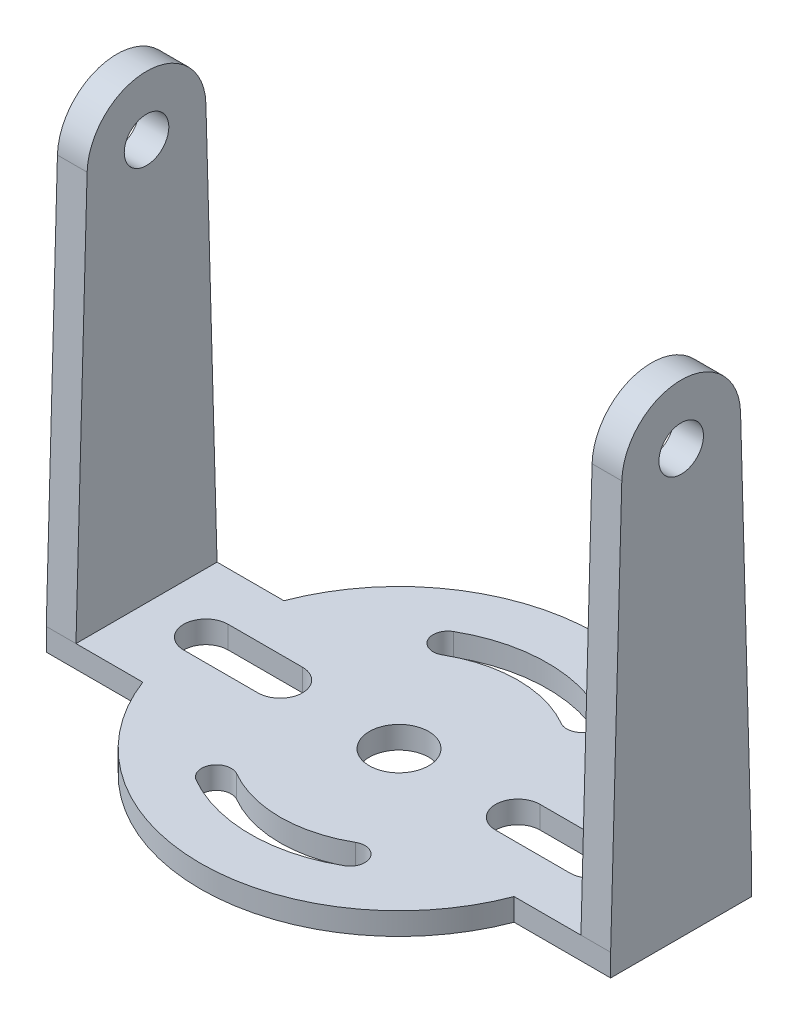
ISO-10303-21;
HEADER;
FILE_DESCRIPTION(('STEP AP214'),'2;1');
FILE_NAME('part.step','',(''),(''),'','','');
FILE_SCHEMA(('AUTOMOTIVE_DESIGN { 1 0 10303 214 1 1 1 1 }'));
ENDSEC;
DATA;
#1=APPLICATION_CONTEXT('core data for automotive mechanical design processes');
#2=APPLICATION_PROTOCOL_DEFINITION('international standard','automotive_design',2000,#1);
#3=PRODUCT_CONTEXT('',#1,'mechanical');
#4=PRODUCT('Part','Part','',(#3));
#5=PRODUCT_RELATED_PRODUCT_CATEGORY('part','',(#4));
#6=PRODUCT_DEFINITION_FORMATION('','',#4);
#7=PRODUCT_DEFINITION_CONTEXT('part definition',#1,'design');
#8=PRODUCT_DEFINITION('design','',#6,#7);
#9=PRODUCT_DEFINITION_SHAPE('','',#8);
#10=(LENGTH_UNIT() NAMED_UNIT(*) SI_UNIT(.MILLI.,.METRE.));
#11=(NAMED_UNIT(*) PLANE_ANGLE_UNIT() SI_UNIT($,.RADIAN.));
#12=(NAMED_UNIT(*) SI_UNIT($,.STERADIAN.) SOLID_ANGLE_UNIT());
#13=UNCERTAINTY_MEASURE_WITH_UNIT(LENGTH_MEASURE(1.E-05),#10,'distance_accuracy_value','');
#14=(GEOMETRIC_REPRESENTATION_CONTEXT(3) GLOBAL_UNCERTAINTY_ASSIGNED_CONTEXT((#13)) GLOBAL_UNIT_ASSIGNED_CONTEXT((#10,
#11,#12)) REPRESENTATION_CONTEXT('',''));
#15=CARTESIAN_POINT('',(0.,0.,0.));
#16=DIRECTION('',(0.,0.,1.));
#17=DIRECTION('',(1.,0.,0.));
#18=AXIS2_PLACEMENT_3D('',#15,#16,#17);
#19=CARTESIAN_POINT('',(38.,0.,0.));
#20=DIRECTION('',(-1.,0.,0.));
#21=DIRECTION('',(0.,0.,1.));
#22=AXIS2_PLACEMENT_3D('',#19,#20,#21);
#23=CYLINDRICAL_SURFACE('',#22,4.);
#24=DIRECTION('',(-1.,0.,0.));
#25=VECTOR('',#24,1.);
#26=CARTESIAN_POINT('',(38.,0.110840887532748,-3.99846399229141));
#27=LINE('',#26,#25);
#28=CARTESIAN_POINT('',(38.,0.110840887532748,-3.99846399229141));
#29=VERTEX_POINT('',#28);
#30=CARTESIAN_POINT('',(36.,0.11084088753275,-3.99846399229141));
#31=VERTEX_POINT('',#30);
#32=EDGE_CURVE('E538',#29,#31,#27,.T.);
#33=ORIENTED_EDGE('',*,*,#32,.T.);
#34=CARTESIAN_POINT('',(36.,0.,0.));
#35=DIRECTION('',(1.,0.,0.));
#36=DIRECTION('',(0.,0.,-1.));
#37=AXIS2_PLACEMENT_3D('',#34,#35,#36);
#38=CIRCLE('',#37,4.);
#39=CARTESIAN_POINT('',(36.,0.110840887532748,3.99846399229141));
#40=VERTEX_POINT('',#39);
#41=EDGE_CURVE('E426',#31,#40,#38,.T.);
#42=ORIENTED_EDGE('',*,*,#41,.T.);
#43=DIRECTION('',(-1.,0.,0.));
#44=VECTOR('',#43,1.);
#45=CARTESIAN_POINT('',(38.,0.110840887532748,3.99846399229141));
#46=LINE('',#45,#44);
#47=CARTESIAN_POINT('',(38.,0.110840887532748,3.99846399229141));
#48=VERTEX_POINT('',#47);
#49=EDGE_CURVE('E551',#48,#40,#46,.T.);
#50=ORIENTED_EDGE('',*,*,#49,.F.);
#51=CARTESIAN_POINT('',(38.,0.,0.));
#52=DIRECTION('',(1.,0.,0.));
#53=DIRECTION('',(0.,0.,-1.));
#54=AXIS2_PLACEMENT_3D('',#51,#52,#53);
#55=CIRCLE('',#54,4.);
#56=EDGE_CURVE('E516',#29,#48,#55,.T.);
#57=ORIENTED_EDGE('',*,*,#56,.F.);
#58=EDGE_LOOP('',(#33,#42,#50,#57));
#59=FACE_BOUND('',#58,.T.);
#60=ADVANCED_FACE('F42',(#59),#23,.T.);
#61=CARTESIAN_POINT('',(38.,0.110840887532748,3.99846399229141));
#62=DIRECTION('',(0.,-0.0277102218831869,-0.999615998072852));
#63=DIRECTION('',(0.,0.999615998072852,-0.0277102218831869));
#64=AXIS2_PLACEMENT_3D('',#61,#62,#63);
#65=PLANE('',#64);
#66=DIRECTION('',(-1.,0.,0.));
#67=VECTOR('',#66,1.);
#68=CARTESIAN_POINT('',(6.5,-27.,4.75));
#69=LINE('',#68,#67);
#70=CARTESIAN_POINT('',(2.,-27.,4.75));
#71=VERTEX_POINT('',#70);
#72=CARTESIAN_POINT('',(0.,-27.,4.75));
#73=VERTEX_POINT('',#72);
#74=EDGE_CURVE('E480',#71,#73,#69,.T.);
#75=ORIENTED_EDGE('',*,*,#74,.F.);
#76=DIRECTION('',(0.,0.999615998072852,-0.0277102218831869));
#77=VECTOR('',#76,1.);
#78=CARTESIAN_POINT('',(2.,0.110840887532748,3.99846399229141));
#79=LINE('',#78,#77);
#80=CARTESIAN_POINT('',(2.,0.110840887532748,3.99846399229141));
#81=VERTEX_POINT('',#80);
#82=EDGE_CURVE('E437',#71,#81,#79,.T.);
#83=ORIENTED_EDGE('',*,*,#82,.T.);
#84=CARTESIAN_POINT('',(0.,0.110840887532748,3.99846399229141));
#85=VERTEX_POINT('',#84);
#86=EDGE_CURVE('E550',#81,#85,#46,.T.);
#87=ORIENTED_EDGE('',*,*,#86,.T.);
#88=DIRECTION('',(0.,-0.999615998072852,0.0277102218831869));
#89=VECTOR('',#88,1.);
#90=CARTESIAN_POINT('',(0.,0.110840887532748,3.99846399229141));
#91=LINE('',#90,#89);
#92=EDGE_CURVE('E531',#85,#73,#91,.T.);
#93=ORIENTED_EDGE('',*,*,#92,.T.);
#94=EDGE_LOOP('',(#75,#83,#87,#93));
#95=FACE_BOUND('',#94,.T.);
#96=ADVANCED_FACE('F643',(#95),#65,.F.);
#97=CARTESIAN_POINT('',(38.,-27.,-4.75));
#98=DIRECTION('',(0.,-0.0277102218831869,0.999615998072852));
#99=DIRECTION('',(0.,-0.999615998072852,-0.0277102218831869));
#100=AXIS2_PLACEMENT_3D('',#97,#98,#99);
#101=PLANE('',#100);
#102=CARTESIAN_POINT('',(2.,0.11084088753275,-3.99846399229141));
#103=VERTEX_POINT('',#102);
#104=CARTESIAN_POINT('',(0.,0.110840887532748,-3.99846399229141));
#105=VERTEX_POINT('',#104);
#106=EDGE_CURVE('E527',#103,#105,#27,.T.);
#107=ORIENTED_EDGE('',*,*,#106,.F.);
#108=DIRECTION('',(0.,-0.999615998072852,-0.0277102218831869));
#109=VECTOR('',#108,1.);
#110=CARTESIAN_POINT('',(2.,-27.,-4.75));
#111=LINE('',#110,#109);
#112=CARTESIAN_POINT('',(2.,-27.,-4.75));
#113=VERTEX_POINT('',#112);
#114=EDGE_CURVE('E11',#103,#113,#111,.T.);
#115=ORIENTED_EDGE('',*,*,#114,.T.);
#116=DIRECTION('',(1.,0.,0.));
#117=VECTOR('',#116,1.);
#118=CARTESIAN_POINT('',(0.,-27.,-4.75));
#119=LINE('',#118,#117);
#120=CARTESIAN_POINT('',(0.,-27.,-4.75));
#121=VERTEX_POINT('',#120);
#122=EDGE_CURVE('E441',#121,#113,#119,.T.);
#123=ORIENTED_EDGE('',*,*,#122,.F.);
#124=DIRECTION('',(0.,0.999615998072852,0.0277102218831869));
#125=VECTOR('',#124,1.);
#126=CARTESIAN_POINT('',(0.,-27.,-4.75));
#127=LINE('',#126,#125);
#128=EDGE_CURVE('E521',#121,#105,#127,.T.);
#129=ORIENTED_EDGE('',*,*,#128,.T.);
#130=EDGE_LOOP('',(#107,#115,#123,#129));
#131=FACE_BOUND('',#130,.T.);
#132=ADVANCED_FACE('F627',(#131),#101,.F.);
#133=CARTESIAN_POINT('',(2.,0.,0.));
#134=DIRECTION('',(-1.,0.,0.));
#135=DIRECTION('',(0.,0.,1.));
#136=AXIS2_PLACEMENT_3D('',#133,#134,#135);
#137=CIRCLE('',#136,4.);
#138=EDGE_CURVE('E434',#81,#103,#137,.T.);
#139=ORIENTED_EDGE('',*,*,#138,.T.);
#140=ORIENTED_EDGE('',*,*,#106,.T.);
#141=CARTESIAN_POINT('',(0.,0.,0.));
#142=DIRECTION('',(1.,0.,0.));
#143=DIRECTION('',(0.,0.,-1.));
#144=AXIS2_PLACEMENT_3D('',#141,#142,#143);
#145=CIRCLE('',#144,4.);
#146=EDGE_CURVE('E515',#105,#85,#145,.T.);
#147=ORIENTED_EDGE('',*,*,#146,.T.);
#148=ORIENTED_EDGE('',*,*,#86,.F.);
#149=EDGE_LOOP('',(#139,#140,#147,#148));
#150=FACE_BOUND('',#149,.T.);
#151=ADVANCED_FACE('F44',(#150),#23,.T.);
#152=ORIENTED_EDGE('',*,*,#49,.T.);
#153=DIRECTION('',(0.,-0.999615998072852,0.0277102218831869));
#154=VECTOR('',#153,1.);
#155=CARTESIAN_POINT('',(36.,0.110840887532748,3.99846399229141));
#156=LINE('',#155,#154);
#157=CARTESIAN_POINT('',(36.,-27.,4.75));
#158=VERTEX_POINT('',#157);
#159=EDGE_CURVE('E430',#40,#158,#156,.T.);
#160=ORIENTED_EDGE('',*,*,#159,.T.);
#161=DIRECTION('',(-1.,0.,0.));
#162=VECTOR('',#161,1.);
#163=CARTESIAN_POINT('',(38.,-27.,4.75));
#164=LINE('',#163,#162);
#165=CARTESIAN_POINT('',(38.,-27.,4.75));
#166=VERTEX_POINT('',#165);
#167=EDGE_CURVE('E546',#166,#158,#164,.T.);
#168=ORIENTED_EDGE('',*,*,#167,.F.);
#169=DIRECTION('',(0.,-0.999615998072852,0.0277102218831869));
#170=VECTOR('',#169,1.);
#171=CARTESIAN_POINT('',(38.,0.110840887532748,3.99846399229141));
#172=LINE('',#171,#170);
#173=EDGE_CURVE('E520',#48,#166,#172,.T.);
#174=ORIENTED_EDGE('',*,*,#173,.F.);
#175=EDGE_LOOP('',(#152,#160,#168,#174));
#176=FACE_BOUND('',#175,.T.);
#177=ADVANCED_FACE('F671',(#176),#65,.F.);
#178=DIRECTION('',(-1.,0.,0.));
#179=VECTOR('',#178,1.);
#180=CARTESIAN_POINT('',(38.,-27.,-4.75));
#181=LINE('',#180,#179);
#182=CARTESIAN_POINT('',(38.,-27.,-4.75));
#183=VERTEX_POINT('',#182);
#184=CARTESIAN_POINT('',(36.,-27.,-4.75));
#185=VERTEX_POINT('',#184);
#186=EDGE_CURVE('E542',#183,#185,#181,.T.);
#187=ORIENTED_EDGE('',*,*,#186,.T.);
#188=DIRECTION('',(0.,0.999615998072852,0.0277102218831869));
#189=VECTOR('',#188,1.);
#190=CARTESIAN_POINT('',(36.,-27.,-4.75));
#191=LINE('',#190,#189);
#192=EDGE_CURVE('E52',#185,#31,#191,.T.);
#193=ORIENTED_EDGE('',*,*,#192,.T.);
#194=ORIENTED_EDGE('',*,*,#32,.F.);
#195=DIRECTION('',(0.,0.999615998072852,0.0277102218831869));
#196=VECTOR('',#195,1.);
#197=CARTESIAN_POINT('',(38.,-27.,-4.75));
#198=LINE('',#197,#196);
#199=EDGE_CURVE('E524',#183,#29,#198,.T.);
#200=ORIENTED_EDGE('',*,*,#199,.F.);
#201=EDGE_LOOP('',(#187,#193,#194,#200));
#202=FACE_BOUND('',#201,.T.);
#203=ADVANCED_FACE('F559',(#202),#101,.F.);
#204=CARTESIAN_POINT('',(38.,0.,0.));
#205=DIRECTION('',(1.,0.,0.));
#206=DIRECTION('',(0.,0.,-1.));
#207=AXIS2_PLACEMENT_3D('',#204,#205,#206);
#208=PLANE('',#207);
#209=CARTESIAN_POINT('',(38.,0.,0.));
#210=DIRECTION('',(1.,0.,0.));
#211=DIRECTION('',(0.,0.,-1.));
#212=AXIS2_PLACEMENT_3D('',#209,#210,#211);
#213=CIRCLE('',#212,1.5);
#214=CARTESIAN_POINT('',(38.,0.,-1.5));
#215=VERTEX_POINT('',#214);
#216=EDGE_CURVE('E1073',#215,#215,#213,.F.);
#217=ORIENTED_EDGE('',*,*,#216,.T.);
#218=EDGE_LOOP('',(#217));
#219=FACE_BOUND('',#218,.T.);
#220=ORIENTED_EDGE('',*,*,#56,.T.);
#221=ORIENTED_EDGE('',*,*,#173,.T.);
#222=DIRECTION('',(0.,1.,0.));
#223=VECTOR('',#222,1.);
#224=CARTESIAN_POINT('',(38.,-28.5,4.75));
#225=LINE('',#224,#223);
#226=CARTESIAN_POINT('',(38.,-28.5,4.75));
#227=VERTEX_POINT('',#226);
#228=EDGE_CURVE('E495',#227,#166,#225,.T.);
#229=ORIENTED_EDGE('',*,*,#228,.F.);
#230=DIRECTION('',(0.,0.,1.));
#231=VECTOR('',#230,1.);
#232=CARTESIAN_POINT('',(38.,-28.5,-4.75));
#233=LINE('',#232,#231);
#234=CARTESIAN_POINT('',(38.,-28.5,-4.75));
#235=VERTEX_POINT('',#234);
#236=EDGE_CURVE('E456',#235,#227,#233,.T.);
#237=ORIENTED_EDGE('',*,*,#236,.F.);
#238=DIRECTION('',(0.,1.,0.));
#239=VECTOR('',#238,1.);
#240=CARTESIAN_POINT('',(38.,-28.5,-4.75));
#241=LINE('',#240,#239);
#242=EDGE_CURVE('E499',#235,#183,#241,.T.);
#243=ORIENTED_EDGE('',*,*,#242,.T.);
#244=ORIENTED_EDGE('',*,*,#199,.T.);
#245=EDGE_LOOP('',(#220,#221,#229,#237,#243,#244));
#246=FACE_BOUND('',#245,.T.);
#247=ADVANCED_FACE('F567',(#219,#246),#208,.T.);
#248=CARTESIAN_POINT('',(0.,0.,0.));
#249=DIRECTION('',(1.,0.,0.));
#250=DIRECTION('',(0.,0.,-1.));
#251=AXIS2_PLACEMENT_3D('',#248,#249,#250);
#252=PLANE('',#251);
#253=CARTESIAN_POINT('',(0.,0.,0.));
#254=DIRECTION('',(-1.,0.,0.));
#255=DIRECTION('',(0.,0.,1.));
#256=AXIS2_PLACEMENT_3D('',#253,#254,#255);
#257=CIRCLE('',#256,1.5);
#258=CARTESIAN_POINT('',(0.,0.,1.5));
#259=VERTEX_POINT('',#258);
#260=EDGE_CURVE('E1068',#259,#259,#257,.T.);
#261=ORIENTED_EDGE('',*,*,#260,.F.);
#262=EDGE_LOOP('',(#261));
#263=FACE_BOUND('',#262,.T.);
#264=ORIENTED_EDGE('',*,*,#146,.F.);
#265=ORIENTED_EDGE('',*,*,#128,.F.);
#266=DIRECTION('',(0.,1.,0.));
#267=VECTOR('',#266,1.);
#268=CARTESIAN_POINT('',(0.,-28.5,-4.75));
#269=LINE('',#268,#267);
#270=CARTESIAN_POINT('',(0.,-28.5,-4.75));
#271=VERTEX_POINT('',#270);
#272=EDGE_CURVE('E511',#271,#121,#269,.T.);
#273=ORIENTED_EDGE('',*,*,#272,.F.);
#274=DIRECTION('',(0.,0.,-1.));
#275=VECTOR('',#274,1.);
#276=CARTESIAN_POINT('',(0.,-28.5,4.75));
#277=LINE('',#276,#275);
#278=CARTESIAN_POINT('',(0.,-28.5,4.75));
#279=VERTEX_POINT('',#278);
#280=EDGE_CURVE('E442',#279,#271,#277,.T.);
#281=ORIENTED_EDGE('',*,*,#280,.F.);
#282=DIRECTION('',(0.,1.,0.));
#283=VECTOR('',#282,1.);
#284=CARTESIAN_POINT('',(0.,-28.5,4.75));
#285=LINE('',#284,#283);
#286=EDGE_CURVE('E468',#279,#73,#285,.T.);
#287=ORIENTED_EDGE('',*,*,#286,.T.);
#288=ORIENTED_EDGE('',*,*,#92,.F.);
#289=EDGE_LOOP('',(#264,#265,#273,#281,#287,#288));
#290=FACE_BOUND('',#289,.T.);
#291=ADVANCED_FACE('F602',(#263,#290),#252,.F.);
#292=CARTESIAN_POINT('',(19.,-27.,0.));
#293=DIRECTION('',(0.,-1.,0.));
#294=DIRECTION('',(0.,0.,-1.));
#295=AXIS2_PLACEMENT_3D('',#292,#293,#294);
#296=PLANE('',#295);
#297=CARTESIAN_POINT('',(19.,-27.,0.));
#298=DIRECTION('',(0.,-1.,0.));
#299=DIRECTION('',(0.,0.,-1.));
#300=AXIS2_PLACEMENT_3D('',#297,#298,#299);
#301=CIRCLE('',#300,7.99999999999999);
#302=CARTESIAN_POINT('',(23.,-27.,6.92820323027552));
#303=VERTEX_POINT('',#302);
#304=CARTESIAN_POINT('',(15.,-27.,6.9282032302755));
#305=VERTEX_POINT('',#304);
#306=EDGE_CURVE('E582',#303,#305,#301,.T.);
#307=ORIENTED_EDGE('',*,*,#306,.F.);
#308=CARTESIAN_POINT('',(23.5,-27.,7.79422863406001));
#309=DIRECTION('',(0.,-1.,0.));
#310=DIRECTION('',(0.,0.,-1.));
#311=AXIS2_PLACEMENT_3D('',#308,#309,#310);
#312=CIRCLE('',#311,1.);
#313=CARTESIAN_POINT('',(24.,-27.,8.6602540378444));
#314=VERTEX_POINT('',#313);
#315=EDGE_CURVE('E283',#314,#303,#312,.F.);
#316=ORIENTED_EDGE('',*,*,#315,.F.);
#317=CARTESIAN_POINT('',(19.,-27.,0.));
#318=DIRECTION('',(0.,-1.,0.));
#319=DIRECTION('',(0.,0.,-1.));
#320=AXIS2_PLACEMENT_3D('',#317,#318,#319);
#321=CIRCLE('',#320,10.);
#322=CARTESIAN_POINT('',(14.,-27.,8.6602540378444));
#323=VERTEX_POINT('',#322);
#324=EDGE_CURVE('E279',#323,#314,#321,.F.);
#325=ORIENTED_EDGE('',*,*,#324,.F.);
#326=CARTESIAN_POINT('',(14.5,-27.,7.79422863405994));
#327=DIRECTION('',(0.,-1.,0.));
#328=DIRECTION('',(0.,0.,-1.));
#329=AXIS2_PLACEMENT_3D('',#326,#327,#328);
#330=CIRCLE('',#329,1.);
#331=EDGE_CURVE('E246',#305,#323,#330,.F.);
#332=ORIENTED_EDGE('',*,*,#331,.F.);
#333=EDGE_LOOP('',(#307,#316,#325,#332));
#334=FACE_BOUND('',#333,.T.);
#335=DIRECTION('',(-1.,0.,0.));
#336=VECTOR('',#335,1.);
#337=CARTESIAN_POINT('',(32.,-27.,-1.5));
#338=LINE('',#337,#336);
#339=CARTESIAN_POINT('',(32.,-27.,-1.5));
#340=VERTEX_POINT('',#339);
#341=CARTESIAN_POINT('',(27.,-27.,-1.5));
#342=VERTEX_POINT('',#341);
#343=EDGE_CURVE('E360',#340,#342,#338,.T.);
#344=ORIENTED_EDGE('',*,*,#343,.F.);
#345=CARTESIAN_POINT('',(32.,-27.,0.));
#346=DIRECTION('',(0.,-1.,0.));
#347=DIRECTION('',(0.,0.,-1.));
#348=AXIS2_PLACEMENT_3D('',#345,#346,#347);
#349=CIRCLE('',#348,1.5);
#350=CARTESIAN_POINT('',(32.,-27.,1.5));
#351=VERTEX_POINT('',#350);
#352=EDGE_CURVE('E330',#351,#340,#349,.F.);
#353=ORIENTED_EDGE('',*,*,#352,.F.);
#354=DIRECTION('',(1.,0.,0.));
#355=VECTOR('',#354,1.);
#356=CARTESIAN_POINT('',(32.,-27.,1.5));
#357=LINE('',#356,#355);
#358=CARTESIAN_POINT('',(27.,-27.,1.5));
#359=VERTEX_POINT('',#358);
#360=EDGE_CURVE('E327',#359,#351,#357,.T.);
#361=ORIENTED_EDGE('',*,*,#360,.F.);
#362=CARTESIAN_POINT('',(27.,-27.,0.));
#363=DIRECTION('',(0.,-1.,0.));
#364=DIRECTION('',(0.,0.,-1.));
#365=AXIS2_PLACEMENT_3D('',#362,#363,#364);
#366=CIRCLE('',#365,1.5);
#367=EDGE_CURVE('E345',#342,#359,#366,.F.);
#368=ORIENTED_EDGE('',*,*,#367,.F.);
#369=EDGE_LOOP('',(#344,#353,#361,#368));
#370=FACE_BOUND('',#369,.T.);
#371=DIRECTION('',(1.,0.,0.));
#372=VECTOR('',#371,1.);
#373=CARTESIAN_POINT('',(6.,-27.,1.5));
#374=LINE('',#373,#372);
#375=CARTESIAN_POINT('',(6.,-27.,1.5));
#376=VERTEX_POINT('',#375);
#377=CARTESIAN_POINT('',(11.,-27.,1.5));
#378=VERTEX_POINT('',#377);
#379=EDGE_CURVE('E321',#376,#378,#374,.T.);
#380=ORIENTED_EDGE('',*,*,#379,.F.);
#381=CARTESIAN_POINT('',(6.,-27.,0.));
#382=DIRECTION('',(0.,-1.,0.));
#383=DIRECTION('',(0.,0.,-1.));
#384=AXIS2_PLACEMENT_3D('',#381,#382,#383);
#385=CIRCLE('',#384,1.5);
#386=CARTESIAN_POINT('',(6.,-27.,-1.5));
#387=VERTEX_POINT('',#386);
#388=EDGE_CURVE('E287',#387,#376,#385,.F.);
#389=ORIENTED_EDGE('',*,*,#388,.F.);
#390=DIRECTION('',(-1.,0.,0.));
#391=VECTOR('',#390,1.);
#392=CARTESIAN_POINT('',(6.,-27.,-1.5));
#393=LINE('',#392,#391);
#394=CARTESIAN_POINT('',(11.,-27.,-1.5));
#395=VERTEX_POINT('',#394);
#396=EDGE_CURVE('E284',#395,#387,#393,.T.);
#397=ORIENTED_EDGE('',*,*,#396,.F.);
#398=CARTESIAN_POINT('',(11.,-27.,0.));
#399=DIRECTION('',(0.,-1.,0.));
#400=DIRECTION('',(0.,0.,-1.));
#401=AXIS2_PLACEMENT_3D('',#398,#399,#400);
#402=CIRCLE('',#401,1.5);
#403=EDGE_CURVE('E303',#378,#395,#402,.F.);
#404=ORIENTED_EDGE('',*,*,#403,.F.);
#405=EDGE_LOOP('',(#380,#389,#397,#404));
#406=FACE_BOUND('',#405,.T.);
#407=CARTESIAN_POINT('',(19.,-27.,0.));
#408=DIRECTION('',(0.,-1.,0.));
#409=DIRECTION('',(0.,0.,-1.));
#410=AXIS2_PLACEMENT_3D('',#407,#408,#409);
#411=CIRCLE('',#410,2.);
#412=CARTESIAN_POINT('',(19.,-27.,-2.));
#413=VERTEX_POINT('',#412);
#414=EDGE_CURVE('E318',#413,#413,#411,.F.);
#415=ORIENTED_EDGE('',*,*,#414,.F.);
#416=EDGE_LOOP('',(#415));
#417=FACE_BOUND('',#416,.T.);
#418=CARTESIAN_POINT('',(14.5,-27.,-7.79422863405994));
#419=DIRECTION('',(0.,-1.,0.));
#420=DIRECTION('',(0.,0.,-1.));
#421=AXIS2_PLACEMENT_3D('',#418,#419,#420);
#422=CIRCLE('',#421,1.);
#423=CARTESIAN_POINT('',(14.,-27.,-8.66025403784439));
#424=VERTEX_POINT('',#423);
#425=CARTESIAN_POINT('',(15.,-27.,-6.92820323027552));
#426=VERTEX_POINT('',#425);
#427=EDGE_CURVE('E401',#424,#426,#422,.F.);
#428=ORIENTED_EDGE('',*,*,#427,.F.);
#429=CARTESIAN_POINT('',(19.,-27.,0.));
#430=DIRECTION('',(0.,-1.,0.));
#431=DIRECTION('',(0.,0.,-1.));
#432=AXIS2_PLACEMENT_3D('',#429,#430,#431);
#433=CIRCLE('',#432,10.);
#434=CARTESIAN_POINT('',(24.,-27.,-8.66025403784444));
#435=VERTEX_POINT('',#434);
#436=EDGE_CURVE('E368',#435,#424,#433,.F.);
#437=ORIENTED_EDGE('',*,*,#436,.F.);
#438=CARTESIAN_POINT('',(23.5,-27.,-7.79422863406001));
#439=DIRECTION('',(0.,-1.,0.));
#440=DIRECTION('',(0.,0.,-1.));
#441=AXIS2_PLACEMENT_3D('',#438,#439,#440);
#442=CIRCLE('',#441,1.);
#443=CARTESIAN_POINT('',(23.,-27.,-6.92820323027555));
#444=VERTEX_POINT('',#443);
#445=EDGE_CURVE('E365',#444,#435,#442,.F.);
#446=ORIENTED_EDGE('',*,*,#445,.F.);
#447=CARTESIAN_POINT('',(19.,-27.,0.));
#448=DIRECTION('',(0.,-1.,0.));
#449=DIRECTION('',(0.,0.,-1.));
#450=AXIS2_PLACEMENT_3D('',#447,#448,#449);
#451=CIRCLE('',#450,7.99999999999999);
#452=EDGE_CURVE('E384',#426,#444,#451,.T.);
#453=ORIENTED_EDGE('',*,*,#452,.F.);
#454=EDGE_LOOP('',(#428,#437,#446,#453));
#455=FACE_BOUND('',#454,.T.);
#456=CARTESIAN_POINT('',(19.,-27.,0.));
#457=DIRECTION('',(0.,-1.,0.));
#458=DIRECTION('',(0.,0.,-1.));
#459=AXIS2_PLACEMENT_3D('',#456,#457,#458);
#460=CIRCLE('',#459,13.3720791203163);
#461=CARTESIAN_POINT('',(6.5,-27.,-4.75));
#462=VERTEX_POINT('',#461);
#463=CARTESIAN_POINT('',(31.5,-27.,-4.75));
#464=VERTEX_POINT('',#463);
#465=EDGE_CURVE('E472',#462,#464,#460,.T.);
#466=ORIENTED_EDGE('',*,*,#465,.F.);
#467=DIRECTION('',(1.,0.,0.));
#468=VECTOR('',#467,1.);
#469=CARTESIAN_POINT('',(2.,-27.,-4.75));
#470=LINE('',#469,#468);
#471=EDGE_CURVE('E417',#113,#462,#470,.T.);
#472=ORIENTED_EDGE('',*,*,#471,.F.);
#473=DIRECTION('',(0.,0.,-1.));
#474=VECTOR('',#473,1.);
#475=CARTESIAN_POINT('',(2.,-27.,4.75));
#476=LINE('',#475,#474);
#477=EDGE_CURVE('E282',#71,#113,#476,.T.);
#478=ORIENTED_EDGE('',*,*,#477,.F.);
#479=CARTESIAN_POINT('',(6.5,-27.,4.75));
#480=VERTEX_POINT('',#479);
#481=EDGE_CURVE('E447',#480,#71,#69,.T.);
#482=ORIENTED_EDGE('',*,*,#481,.F.);
#483=CARTESIAN_POINT('',(19.,-27.,0.));
#484=DIRECTION('',(0.,-1.,0.));
#485=DIRECTION('',(0.,0.,-1.));
#486=AXIS2_PLACEMENT_3D('',#483,#484,#485);
#487=CIRCLE('',#486,13.3720791203163);
#488=CARTESIAN_POINT('',(31.5,-27.,4.75));
#489=VERTEX_POINT('',#488);
#490=EDGE_CURVE('E476',#489,#480,#487,.T.);
#491=ORIENTED_EDGE('',*,*,#490,.F.);
#492=DIRECTION('',(-1.,0.,0.));
#493=VECTOR('',#492,1.);
#494=CARTESIAN_POINT('',(2.,-27.,4.75));
#495=LINE('',#494,#493);
#496=EDGE_CURVE('E423',#158,#489,#495,.T.);
#497=ORIENTED_EDGE('',*,*,#496,.F.);
#498=DIRECTION('',(0.,0.,1.));
#499=VECTOR('',#498,1.);
#500=CARTESIAN_POINT('',(36.,-27.,4.75));
#501=LINE('',#500,#499);
#502=EDGE_CURVE('E420',#185,#158,#501,.T.);
#503=ORIENTED_EDGE('',*,*,#502,.F.);
#504=EDGE_CURVE('E416',#464,#185,#470,.T.);
#505=ORIENTED_EDGE('',*,*,#504,.F.);
#506=EDGE_LOOP('',(#466,#472,#478,#482,#491,#497,#503,#505));
#507=FACE_BOUND('',#506,.T.);
#508=ADVANCED_FACE('F598',(#334,#370,#406,#417,#455,#507),#296,.F.);
#509=CARTESIAN_POINT('',(0.,-28.5,-4.75));
#510=DIRECTION('',(0.,0.,1.));
#511=DIRECTION('',(1.,0.,0.));
#512=AXIS2_PLACEMENT_3D('',#509,#510,#511);
#513=PLANE('',#512);
#514=ORIENTED_EDGE('',*,*,#122,.T.);
#515=ORIENTED_EDGE('',*,*,#471,.T.);
#516=DIRECTION('',(0.,1.,0.));
#517=VECTOR('',#516,1.);
#518=CARTESIAN_POINT('',(6.5,-28.5,-4.74999999999999));
#519=LINE('',#518,#517);
#520=CARTESIAN_POINT('',(6.5,-28.5,-4.74999999999999));
#521=VERTEX_POINT('',#520);
#522=EDGE_CURVE('E507',#521,#462,#519,.T.);
#523=ORIENTED_EDGE('',*,*,#522,.F.);
#524=DIRECTION('',(1.,0.,0.));
#525=VECTOR('',#524,1.);
#526=CARTESIAN_POINT('',(0.,-28.5,-4.75));
#527=LINE('',#526,#525);
#528=EDGE_CURVE('E446',#271,#521,#527,.T.);
#529=ORIENTED_EDGE('',*,*,#528,.F.);
#530=ORIENTED_EDGE('',*,*,#272,.T.);
#531=EDGE_LOOP('',(#514,#515,#523,#529,#530));
#532=FACE_BOUND('',#531,.T.);
#533=ADVANCED_FACE('F601',(#532),#513,.F.);
#534=CARTESIAN_POINT('',(19.,-28.5,0.));
#535=DIRECTION('',(0.,1.,0.));
#536=DIRECTION('',(0.,0.,1.));
#537=AXIS2_PLACEMENT_3D('',#534,#535,#536);
#538=CYLINDRICAL_SURFACE('',#537,13.3720791203163);
#539=ORIENTED_EDGE('',*,*,#465,.T.);
#540=DIRECTION('',(0.,1.,0.));
#541=VECTOR('',#540,1.);
#542=CARTESIAN_POINT('',(31.5,-28.5,-4.75));
#543=LINE('',#542,#541);
#544=CARTESIAN_POINT('',(31.5,-28.5,-4.75));
#545=VERTEX_POINT('',#544);
#546=EDGE_CURVE('E503',#545,#464,#543,.T.);
#547=ORIENTED_EDGE('',*,*,#546,.F.);
#548=CARTESIAN_POINT('',(19.,-28.5,0.));
#549=DIRECTION('',(0.,-1.,0.));
#550=DIRECTION('',(0.,0.,-1.));
#551=AXIS2_PLACEMENT_3D('',#548,#549,#550);
#552=CIRCLE('',#551,13.3720791203163);
#553=EDGE_CURVE('E450',#521,#545,#552,.T.);
#554=ORIENTED_EDGE('',*,*,#553,.F.);
#555=ORIENTED_EDGE('',*,*,#522,.T.);
#556=EDGE_LOOP('',(#539,#547,#554,#555));
#557=FACE_BOUND('',#556,.T.);
#558=ADVANCED_FACE('F619',(#557),#538,.T.);
#559=CARTESIAN_POINT('',(31.5,-28.5,-4.75));
#560=DIRECTION('',(0.,0.,1.));
#561=DIRECTION('',(1.,0.,0.));
#562=AXIS2_PLACEMENT_3D('',#559,#560,#561);
#563=PLANE('',#562);
#564=ORIENTED_EDGE('',*,*,#186,.F.);
#565=ORIENTED_EDGE('',*,*,#242,.F.);
#566=DIRECTION('',(1.,0.,0.));
#567=VECTOR('',#566,1.);
#568=CARTESIAN_POINT('',(31.5,-28.5,-4.75));
#569=LINE('',#568,#567);
#570=EDGE_CURVE('E453',#545,#235,#569,.T.);
#571=ORIENTED_EDGE('',*,*,#570,.F.);
#572=ORIENTED_EDGE('',*,*,#546,.T.);
#573=ORIENTED_EDGE('',*,*,#504,.T.);
#574=EDGE_LOOP('',(#564,#565,#571,#572,#573));
#575=FACE_BOUND('',#574,.T.);
#576=ADVANCED_FACE('F574',(#575),#563,.F.);
#577=CARTESIAN_POINT('',(38.,-28.5,4.75));
#578=DIRECTION('',(0.,0.,-1.));
#579=DIRECTION('',(-1.,0.,0.));
#580=AXIS2_PLACEMENT_3D('',#577,#578,#579);
#581=PLANE('',#580);
#582=ORIENTED_EDGE('',*,*,#167,.T.);
#583=ORIENTED_EDGE('',*,*,#496,.T.);
#584=DIRECTION('',(0.,1.,0.));
#585=VECTOR('',#584,1.);
#586=CARTESIAN_POINT('',(31.5,-28.5,4.75));
#587=LINE('',#586,#585);
#588=CARTESIAN_POINT('',(31.5,-28.5,4.75));
#589=VERTEX_POINT('',#588);
#590=EDGE_CURVE('E491',#589,#489,#587,.T.);
#591=ORIENTED_EDGE('',*,*,#590,.F.);
#592=DIRECTION('',(-1.,0.,0.));
#593=VECTOR('',#592,1.);
#594=CARTESIAN_POINT('',(38.,-28.5,4.75));
#595=LINE('',#594,#593);
#596=EDGE_CURVE('E459',#227,#589,#595,.T.);
#597=ORIENTED_EDGE('',*,*,#596,.F.);
#598=ORIENTED_EDGE('',*,*,#228,.T.);
#599=EDGE_LOOP('',(#582,#583,#591,#597,#598));
#600=FACE_BOUND('',#599,.T.);
#601=ADVANCED_FACE('F700',(#600),#581,.F.);
#602=CARTESIAN_POINT('',(19.,-28.5,0.));
#603=DIRECTION('',(0.,1.,0.));
#604=DIRECTION('',(0.,0.,1.));
#605=AXIS2_PLACEMENT_3D('',#602,#603,#604);
#606=CYLINDRICAL_SURFACE('',#605,13.3720791203163);
#607=ORIENTED_EDGE('',*,*,#490,.T.);
#608=DIRECTION('',(0.,1.,0.));
#609=VECTOR('',#608,1.);
#610=CARTESIAN_POINT('',(6.5,-28.5,4.75));
#611=LINE('',#610,#609);
#612=CARTESIAN_POINT('',(6.5,-28.5,4.75));
#613=VERTEX_POINT('',#612);
#614=EDGE_CURVE('E487',#613,#480,#611,.T.);
#615=ORIENTED_EDGE('',*,*,#614,.F.);
#616=CARTESIAN_POINT('',(19.,-28.5,0.));
#617=DIRECTION('',(0.,-1.,0.));
#618=DIRECTION('',(0.,0.,-1.));
#619=AXIS2_PLACEMENT_3D('',#616,#617,#618);
#620=CIRCLE('',#619,13.3720791203163);
#621=EDGE_CURVE('E462',#589,#613,#620,.T.);
#622=ORIENTED_EDGE('',*,*,#621,.F.);
#623=ORIENTED_EDGE('',*,*,#590,.T.);
#624=EDGE_LOOP('',(#607,#615,#622,#623));
#625=FACE_BOUND('',#624,.T.);
#626=ADVANCED_FACE('F648',(#625),#606,.T.);
#627=CARTESIAN_POINT('',(6.5,-28.5,4.75));
#628=DIRECTION('',(0.,0.,-1.));
#629=DIRECTION('',(-1.,0.,0.));
#630=AXIS2_PLACEMENT_3D('',#627,#628,#629);
#631=PLANE('',#630);
#632=ORIENTED_EDGE('',*,*,#481,.T.);
#633=ORIENTED_EDGE('',*,*,#74,.T.);
#634=ORIENTED_EDGE('',*,*,#286,.F.);
#635=DIRECTION('',(-1.,0.,0.));
#636=VECTOR('',#635,1.);
#637=CARTESIAN_POINT('',(6.5,-28.5,4.75));
#638=LINE('',#637,#636);
#639=EDGE_CURVE('E465',#613,#279,#638,.T.);
#640=ORIENTED_EDGE('',*,*,#639,.F.);
#641=ORIENTED_EDGE('',*,*,#614,.T.);
#642=EDGE_LOOP('',(#632,#633,#634,#640,#641));
#643=FACE_BOUND('',#642,.T.);
#644=ADVANCED_FACE('F640',(#643),#631,.F.);
#645=CARTESIAN_POINT('',(19.,-28.5,0.));
#646=DIRECTION('',(0.,-1.,0.));
#647=DIRECTION('',(0.,0.,-1.));
#648=AXIS2_PLACEMENT_3D('',#645,#646,#647);
#649=PLANE('',#648);
#650=CARTESIAN_POINT('',(23.5,-28.5,7.79422863406001));
#651=DIRECTION('',(0.,-1.,0.));
#652=DIRECTION('',(0.,0.,1.));
#653=AXIS2_PLACEMENT_3D('',#650,#651,#652);
#654=CIRCLE('',#653,1.);
#655=CARTESIAN_POINT('',(23.,-28.5,6.92820323027552));
#656=VERTEX_POINT('',#655);
#657=CARTESIAN_POINT('',(24.,-28.5,8.6602540378444));
#658=VERTEX_POINT('',#657);
#659=EDGE_CURVE('E260',#656,#658,#654,.T.);
#660=ORIENTED_EDGE('',*,*,#659,.F.);
#661=CARTESIAN_POINT('',(19.,-28.5,0.));
#662=DIRECTION('',(0.,1.,0.));
#663=DIRECTION('',(0.,0.,-1.));
#664=AXIS2_PLACEMENT_3D('',#661,#662,#663);
#665=CIRCLE('',#664,7.99999999999999);
#666=CARTESIAN_POINT('',(15.,-28.5,6.9282032302755));
#667=VERTEX_POINT('',#666);
#668=EDGE_CURVE('E265',#667,#656,#665,.T.);
#669=ORIENTED_EDGE('',*,*,#668,.F.);
#670=CARTESIAN_POINT('',(14.5,-28.5,7.79422863405994));
#671=DIRECTION('',(0.,-1.,0.));
#672=DIRECTION('',(0.,0.,-1.));
#673=AXIS2_PLACEMENT_3D('',#670,#671,#672);
#674=CIRCLE('',#673,1.);
#675=CARTESIAN_POINT('',(14.,-28.5,8.6602540378444));
#676=VERTEX_POINT('',#675);
#677=EDGE_CURVE('E243',#676,#667,#674,.T.);
#678=ORIENTED_EDGE('',*,*,#677,.F.);
#679=CARTESIAN_POINT('',(19.,-28.5,0.));
#680=DIRECTION('',(0.,-1.,0.));
#681=DIRECTION('',(0.,0.,-1.));
#682=AXIS2_PLACEMENT_3D('',#679,#680,#681);
#683=CIRCLE('',#682,10.);
#684=EDGE_CURVE('E254',#658,#676,#683,.T.);
#685=ORIENTED_EDGE('',*,*,#684,.F.);
#686=EDGE_LOOP('',(#660,#669,#678,#685));
#687=FACE_BOUND('',#686,.T.);
#688=CARTESIAN_POINT('',(32.,-28.5,0.));
#689=DIRECTION('',(0.,-1.,0.));
#690=DIRECTION('',(0.,0.,1.));
#691=AXIS2_PLACEMENT_3D('',#688,#689,#690);
#692=CIRCLE('',#691,1.5);
#693=CARTESIAN_POINT('',(32.,-28.5,-1.5));
#694=VERTEX_POINT('',#693);
#695=CARTESIAN_POINT('',(32.,-28.5,1.5));
#696=VERTEX_POINT('',#695);
#697=EDGE_CURVE('E288',#694,#696,#692,.T.);
#698=ORIENTED_EDGE('',*,*,#697,.F.);
#699=DIRECTION('',(1.,0.,0.));
#700=VECTOR('',#699,1.);
#701=CARTESIAN_POINT('',(32.,-28.5,-1.5));
#702=LINE('',#701,#700);
#703=CARTESIAN_POINT('',(27.,-28.5,-1.5));
#704=VERTEX_POINT('',#703);
#705=EDGE_CURVE('E336',#704,#694,#702,.T.);
#706=ORIENTED_EDGE('',*,*,#705,.F.);
#707=CARTESIAN_POINT('',(27.,-28.5,0.));
#708=DIRECTION('',(0.,-1.,0.));
#709=DIRECTION('',(0.,0.,-1.));
#710=AXIS2_PLACEMENT_3D('',#707,#708,#709);
#711=CIRCLE('',#710,1.5);
#712=CARTESIAN_POINT('',(27.,-28.5,1.5));
#713=VERTEX_POINT('',#712);
#714=EDGE_CURVE('E349',#713,#704,#711,.T.);
#715=ORIENTED_EDGE('',*,*,#714,.F.);
#716=DIRECTION('',(-1.,0.,0.));
#717=VECTOR('',#716,1.);
#718=CARTESIAN_POINT('',(32.,-28.5,1.5));
#719=LINE('',#718,#717);
#720=EDGE_CURVE('E353',#696,#713,#719,.T.);
#721=ORIENTED_EDGE('',*,*,#720,.F.);
#722=EDGE_LOOP('',(#698,#706,#715,#721));
#723=FACE_BOUND('',#722,.T.);
#724=CARTESIAN_POINT('',(6.,-28.5,0.));
#725=DIRECTION('',(0.,-1.,0.));
#726=DIRECTION('',(0.,0.,-1.));
#727=AXIS2_PLACEMENT_3D('',#724,#725,#726);
#728=CIRCLE('',#727,1.5);
#729=CARTESIAN_POINT('',(6.,-28.5,1.5));
#730=VERTEX_POINT('',#729);
#731=CARTESIAN_POINT('',(6.,-28.5,-1.5));
#732=VERTEX_POINT('',#731);
#733=EDGE_CURVE('E315',#730,#732,#728,.T.);
#734=ORIENTED_EDGE('',*,*,#733,.F.);
#735=DIRECTION('',(-1.,0.,0.));
#736=VECTOR('',#735,1.);
#737=CARTESIAN_POINT('',(6.,-28.5,1.5));
#738=LINE('',#737,#736);
#739=CARTESIAN_POINT('',(11.,-28.5,1.5));
#740=VERTEX_POINT('',#739);
#741=EDGE_CURVE('E293',#740,#730,#738,.T.);
#742=ORIENTED_EDGE('',*,*,#741,.F.);
#743=CARTESIAN_POINT('',(11.,-28.5,0.));
#744=DIRECTION('',(0.,-1.,0.));
#745=DIRECTION('',(0.,0.,1.));
#746=AXIS2_PLACEMENT_3D('',#743,#744,#745);
#747=CIRCLE('',#746,1.5);
#748=CARTESIAN_POINT('',(11.,-28.5,-1.5));
#749=VERTEX_POINT('',#748);
#750=EDGE_CURVE('E307',#749,#740,#747,.T.);
#751=ORIENTED_EDGE('',*,*,#750,.F.);
#752=DIRECTION('',(1.,0.,0.));
#753=VECTOR('',#752,1.);
#754=CARTESIAN_POINT('',(6.,-28.5,-1.5));
#755=LINE('',#754,#753);
#756=EDGE_CURVE('E311',#732,#749,#755,.T.);
#757=ORIENTED_EDGE('',*,*,#756,.F.);
#758=EDGE_LOOP('',(#734,#742,#751,#757));
#759=FACE_BOUND('',#758,.T.);
#760=CARTESIAN_POINT('',(19.,-28.5,0.));
#761=DIRECTION('',(0.,-1.,0.));
#762=DIRECTION('',(0.,0.,-1.));
#763=AXIS2_PLACEMENT_3D('',#760,#761,#762);
#764=CIRCLE('',#763,2.);
#765=CARTESIAN_POINT('',(19.,-28.5,-2.));
#766=VERTEX_POINT('',#765);
#767=EDGE_CURVE('E369',#766,#766,#764,.T.);
#768=ORIENTED_EDGE('',*,*,#767,.F.);
#769=EDGE_LOOP('',(#768));
#770=FACE_BOUND('',#769,.T.);
#771=CARTESIAN_POINT('',(19.,-28.5,0.));
#772=DIRECTION('',(0.,-1.,0.));
#773=DIRECTION('',(0.,0.,1.));
#774=AXIS2_PLACEMENT_3D('',#771,#772,#773);
#775=CIRCLE('',#774,10.);
#776=CARTESIAN_POINT('',(14.,-28.5,-8.66025403784439));
#777=VERTEX_POINT('',#776);
#778=CARTESIAN_POINT('',(24.,-28.5,-8.66025403784444));
#779=VERTEX_POINT('',#778);
#780=EDGE_CURVE('E396',#777,#779,#775,.T.);
#781=ORIENTED_EDGE('',*,*,#780,.F.);
#782=CARTESIAN_POINT('',(14.5,-28.5,-7.79422863405994));
#783=DIRECTION('',(0.,-1.,0.));
#784=DIRECTION('',(0.,0.,1.));
#785=AXIS2_PLACEMENT_3D('',#782,#783,#784);
#786=CIRCLE('',#785,1.);
#787=CARTESIAN_POINT('',(15.,-28.5,-6.92820323027551));
#788=VERTEX_POINT('',#787);
#789=EDGE_CURVE('E374',#788,#777,#786,.T.);
#790=ORIENTED_EDGE('',*,*,#789,.F.);
#791=CARTESIAN_POINT('',(19.,-28.5,0.));
#792=DIRECTION('',(0.,1.,0.));
#793=DIRECTION('',(0.,0.,1.));
#794=AXIS2_PLACEMENT_3D('',#791,#792,#793);
#795=CIRCLE('',#794,7.99999999999999);
#796=CARTESIAN_POINT('',(23.,-28.5,-6.92820323027555));
#797=VERTEX_POINT('',#796);
#798=EDGE_CURVE('E388',#797,#788,#795,.T.);
#799=ORIENTED_EDGE('',*,*,#798,.F.);
#800=CARTESIAN_POINT('',(23.5,-28.5,-7.79422863406001));
#801=DIRECTION('',(0.,-1.,0.));
#802=DIRECTION('',(0.,0.,-1.));
#803=AXIS2_PLACEMENT_3D('',#800,#801,#802);
#804=CIRCLE('',#803,1.);
#805=EDGE_CURVE('E392',#779,#797,#804,.T.);
#806=ORIENTED_EDGE('',*,*,#805,.F.);
#807=EDGE_LOOP('',(#781,#790,#799,#806));
#808=FACE_BOUND('',#807,.T.);
#809=ORIENTED_EDGE('',*,*,#280,.T.);
#810=ORIENTED_EDGE('',*,*,#528,.T.);
#811=ORIENTED_EDGE('',*,*,#553,.T.);
#812=ORIENTED_EDGE('',*,*,#570,.T.);
#813=ORIENTED_EDGE('',*,*,#236,.T.);
#814=ORIENTED_EDGE('',*,*,#596,.T.);
#815=ORIENTED_EDGE('',*,*,#621,.T.);
#816=ORIENTED_EDGE('',*,*,#639,.T.);
#817=EDGE_LOOP('',(#809,#810,#811,#812,#813,#814,#815,#816));
#818=FACE_BOUND('',#817,.T.);
#819=ADVANCED_FACE('F262',(#687,#723,#759,#770,#808,#818),#649,.T.);
#820=CARTESIAN_POINT('',(2.,4.,4.75));
#821=DIRECTION('',(-1.,0.,0.));
#822=DIRECTION('',(0.,0.,1.));
#823=AXIS2_PLACEMENT_3D('',#820,#821,#822);
#824=PLANE('',#823);
#825=CARTESIAN_POINT('',(2.,0.,0.));
#826=DIRECTION('',(-1.,0.,0.));
#827=DIRECTION('',(0.,0.,1.));
#828=AXIS2_PLACEMENT_3D('',#825,#826,#827);
#829=CIRCLE('',#828,1.5);
#830=CARTESIAN_POINT('',(2.,0.,1.5));
#831=VERTEX_POINT('',#830);
#832=EDGE_CURVE('E331',#831,#831,#829,.T.);
#833=ORIENTED_EDGE('',*,*,#832,.T.);
#834=EDGE_LOOP('',(#833));
#835=FACE_BOUND('',#834,.T.);
#836=ORIENTED_EDGE('',*,*,#477,.T.);
#837=ORIENTED_EDGE('',*,*,#114,.F.);
#838=ORIENTED_EDGE('',*,*,#138,.F.);
#839=ORIENTED_EDGE('',*,*,#82,.F.);
#840=EDGE_LOOP('',(#836,#837,#838,#839));
#841=FACE_BOUND('',#840,.T.);
#842=ADVANCED_FACE('F653',(#835,#841),#824,.F.);
#843=CARTESIAN_POINT('',(36.,4.,4.75));
#844=DIRECTION('',(1.,0.,0.));
#845=DIRECTION('',(0.,0.,-1.));
#846=AXIS2_PLACEMENT_3D('',#843,#844,#845);
#847=PLANE('',#846);
#848=CARTESIAN_POINT('',(36.,0.,0.));
#849=DIRECTION('',(1.,0.,0.));
#850=DIRECTION('',(0.,0.,-1.));
#851=AXIS2_PLACEMENT_3D('',#848,#849,#850);
#852=CIRCLE('',#851,1.5);
#853=CARTESIAN_POINT('',(36.,0.,-1.5));
#854=VERTEX_POINT('',#853);
#855=EDGE_CURVE('E46',#854,#854,#852,.T.);
#856=ORIENTED_EDGE('',*,*,#855,.T.);
#857=EDGE_LOOP('',(#856));
#858=FACE_BOUND('',#857,.T.);
#859=ORIENTED_EDGE('',*,*,#41,.F.);
#860=ORIENTED_EDGE('',*,*,#192,.F.);
#861=ORIENTED_EDGE('',*,*,#502,.T.);
#862=ORIENTED_EDGE('',*,*,#159,.F.);
#863=EDGE_LOOP('',(#859,#860,#861,#862));
#864=FACE_BOUND('',#863,.T.);
#865=ADVANCED_FACE('F655',(#858,#864),#847,.F.);
#866=CARTESIAN_POINT('',(19.,-15.5423837535603,0.));
#867=DIRECTION('',(0.,-1.,0.));
#868=DIRECTION('',(0.,0.,-1.));
#869=AXIS2_PLACEMENT_3D('',#866,#867,#868);
#870=CYLINDRICAL_SURFACE('',#869,10.);
#871=ORIENTED_EDGE('',*,*,#436,.T.);
#872=DIRECTION('',(0.,-1.,0.));
#873=VECTOR('',#872,1.);
#874=CARTESIAN_POINT('',(14.,-15.5423837535603,-8.66025403784439));
#875=LINE('',#874,#873);
#876=EDGE_CURVE('E381',#424,#777,#875,.T.);
#877=ORIENTED_EDGE('',*,*,#876,.T.);
#878=ORIENTED_EDGE('',*,*,#780,.T.);
#879=DIRECTION('',(0.,-1.,0.));
#880=VECTOR('',#879,1.);
#881=CARTESIAN_POINT('',(24.,-15.5423837535603,-8.66025403784444));
#882=LINE('',#881,#880);
#883=EDGE_CURVE('E370',#435,#779,#882,.T.);
#884=ORIENTED_EDGE('',*,*,#883,.F.);
#885=EDGE_LOOP('',(#871,#877,#878,#884));
#886=FACE_BOUND('',#885,.T.);
#887=ADVANCED_FACE('F662',(#886),#870,.F.);
#888=CARTESIAN_POINT('',(14.5,-15.5423837535603,-7.79422863405994));
#889=DIRECTION('',(0.,-1.,0.));
#890=DIRECTION('',(0.,0.,-1.));
#891=AXIS2_PLACEMENT_3D('',#888,#889,#890);
#892=CYLINDRICAL_SURFACE('',#891,1.);
#893=ORIENTED_EDGE('',*,*,#427,.T.);
#894=DIRECTION('',(0.,-1.,0.));
#895=VECTOR('',#894,1.);
#896=CARTESIAN_POINT('',(15.,-15.5423837535603,-6.92820323027551));
#897=LINE('',#896,#895);
#898=EDGE_CURVE('E378',#426,#788,#897,.T.);
#899=ORIENTED_EDGE('',*,*,#898,.T.);
#900=ORIENTED_EDGE('',*,*,#789,.T.);
#901=ORIENTED_EDGE('',*,*,#876,.F.);
#902=EDGE_LOOP('',(#893,#899,#900,#901));
#903=FACE_BOUND('',#902,.T.);
#904=ADVANCED_FACE('F729',(#903),#892,.F.);
#905=CARTESIAN_POINT('',(19.,-15.5423837535603,0.));
#906=DIRECTION('',(0.,-1.,0.));
#907=DIRECTION('',(0.,0.,-1.));
#908=AXIS2_PLACEMENT_3D('',#905,#906,#907);
#909=CYLINDRICAL_SURFACE('',#908,7.99999999999999);
#910=ORIENTED_EDGE('',*,*,#452,.T.);
#911=DIRECTION('',(0.,-1.,0.));
#912=VECTOR('',#911,1.);
#913=CARTESIAN_POINT('',(23.,-15.5423837535603,-6.92820323027555));
#914=LINE('',#913,#912);
#915=EDGE_CURVE('E375',#444,#797,#914,.T.);
#916=ORIENTED_EDGE('',*,*,#915,.T.);
#917=ORIENTED_EDGE('',*,*,#798,.T.);
#918=ORIENTED_EDGE('',*,*,#898,.F.);
#919=EDGE_LOOP('',(#910,#916,#917,#918));
#920=FACE_BOUND('',#919,.T.);
#921=ADVANCED_FACE('F741',(#920),#909,.T.);
#922=CARTESIAN_POINT('',(23.5,-15.5423837535603,-7.79422863406001));
#923=DIRECTION('',(0.,-1.,0.));
#924=DIRECTION('',(0.,0.,-1.));
#925=AXIS2_PLACEMENT_3D('',#922,#923,#924);
#926=CYLINDRICAL_SURFACE('',#925,1.);
#927=ORIENTED_EDGE('',*,*,#445,.T.);
#928=ORIENTED_EDGE('',*,*,#883,.T.);
#929=ORIENTED_EDGE('',*,*,#805,.T.);
#930=ORIENTED_EDGE('',*,*,#915,.F.);
#931=EDGE_LOOP('',(#927,#928,#929,#930));
#932=FACE_BOUND('',#931,.T.);
#933=ADVANCED_FACE('F752',(#932),#926,.F.);
#934=CARTESIAN_POINT('',(19.,-15.5423837535603,0.));
#935=DIRECTION('',(0.,-1.,0.));
#936=DIRECTION('',(0.,0.,-1.));
#937=AXIS2_PLACEMENT_3D('',#934,#935,#936);
#938=CYLINDRICAL_SURFACE('',#937,2.);
#939=ORIENTED_EDGE('',*,*,#414,.T.);
#940=EDGE_LOOP('',(#939));
#941=FACE_BOUND('',#940,.T.);
#942=ORIENTED_EDGE('',*,*,#767,.T.);
#943=EDGE_LOOP('',(#942));
#944=FACE_BOUND('',#943,.T.);
#945=ADVANCED_FACE('F763',(#941,#944),#938,.F.);
#946=CARTESIAN_POINT('',(6.,-15.5423837535603,0.));
#947=DIRECTION('',(0.,-1.,0.));
#948=DIRECTION('',(0.,0.,-1.));
#949=AXIS2_PLACEMENT_3D('',#946,#947,#948);
#950=CYLINDRICAL_SURFACE('',#949,1.5);
#951=ORIENTED_EDGE('',*,*,#388,.T.);
#952=DIRECTION('',(0.,-1.,0.));
#953=VECTOR('',#952,1.);
#954=CARTESIAN_POINT('',(6.,-15.5423837535603,1.5));
#955=LINE('',#954,#953);
#956=EDGE_CURVE('E300',#376,#730,#955,.T.);
#957=ORIENTED_EDGE('',*,*,#956,.T.);
#958=ORIENTED_EDGE('',*,*,#733,.T.);
#959=DIRECTION('',(0.,-1.,0.));
#960=VECTOR('',#959,1.);
#961=CARTESIAN_POINT('',(6.,-15.5423837535603,-1.5));
#962=LINE('',#961,#960);
#963=EDGE_CURVE('E289',#387,#732,#962,.T.);
#964=ORIENTED_EDGE('',*,*,#963,.F.);
#965=EDGE_LOOP('',(#951,#957,#958,#964));
#966=FACE_BOUND('',#965,.T.);
#967=ADVANCED_FACE('F774',(#966),#950,.F.);
#968=CARTESIAN_POINT('',(6.,-15.5423837535603,1.5));
#969=DIRECTION('',(0.,0.,1.));
#970=DIRECTION('',(1.,0.,0.));
#971=AXIS2_PLACEMENT_3D('',#968,#969,#970);
#972=PLANE('',#971);
#973=ORIENTED_EDGE('',*,*,#379,.T.);
#974=DIRECTION('',(0.,-1.,0.));
#975=VECTOR('',#974,1.);
#976=CARTESIAN_POINT('',(11.,-15.5423837535603,1.5));
#977=LINE('',#976,#975);
#978=EDGE_CURVE('E297',#378,#740,#977,.T.);
#979=ORIENTED_EDGE('',*,*,#978,.T.);
#980=ORIENTED_EDGE('',*,*,#741,.T.);
#981=ORIENTED_EDGE('',*,*,#956,.F.);
#982=EDGE_LOOP('',(#973,#979,#980,#981));
#983=FACE_BOUND('',#982,.T.);
#984=ADVANCED_FACE('F785',(#983),#972,.F.);
#985=CARTESIAN_POINT('',(11.,-15.5423837535603,0.));
#986=DIRECTION('',(0.,-1.,0.));
#987=DIRECTION('',(0.,0.,-1.));
#988=AXIS2_PLACEMENT_3D('',#985,#986,#987);
#989=CYLINDRICAL_SURFACE('',#988,1.5);
#990=ORIENTED_EDGE('',*,*,#403,.T.);
#991=DIRECTION('',(0.,-1.,0.));
#992=VECTOR('',#991,1.);
#993=CARTESIAN_POINT('',(11.,-15.5423837535603,-1.5));
#994=LINE('',#993,#992);
#995=EDGE_CURVE('E294',#395,#749,#994,.T.);
#996=ORIENTED_EDGE('',*,*,#995,.T.);
#997=ORIENTED_EDGE('',*,*,#750,.T.);
#998=ORIENTED_EDGE('',*,*,#978,.F.);
#999=EDGE_LOOP('',(#990,#996,#997,#998));
#1000=FACE_BOUND('',#999,.T.);
#1001=ADVANCED_FACE('F796',(#1000),#989,.F.);
#1002=CARTESIAN_POINT('',(6.,-15.5423837535603,-1.5));
#1003=DIRECTION('',(0.,0.,-1.));
#1004=DIRECTION('',(-1.,0.,0.));
#1005=AXIS2_PLACEMENT_3D('',#1002,#1003,#1004);
#1006=PLANE('',#1005);
#1007=ORIENTED_EDGE('',*,*,#396,.T.);
#1008=ORIENTED_EDGE('',*,*,#963,.T.);
#1009=ORIENTED_EDGE('',*,*,#756,.T.);
#1010=ORIENTED_EDGE('',*,*,#995,.F.);
#1011=EDGE_LOOP('',(#1007,#1008,#1009,#1010));
#1012=FACE_BOUND('',#1011,.T.);
#1013=ADVANCED_FACE('F807',(#1012),#1006,.F.);
#1014=CARTESIAN_POINT('',(32.,-15.5423837535603,0.));
#1015=DIRECTION('',(0.,-1.,0.));
#1016=DIRECTION('',(0.,0.,-1.));
#1017=AXIS2_PLACEMENT_3D('',#1014,#1015,#1016);
#1018=CYLINDRICAL_SURFACE('',#1017,1.5);
#1019=ORIENTED_EDGE('',*,*,#352,.T.);
#1020=DIRECTION('',(0.,-1.,0.));
#1021=VECTOR('',#1020,1.);
#1022=CARTESIAN_POINT('',(32.,-15.5423837535603,-1.5));
#1023=LINE('',#1022,#1021);
#1024=EDGE_CURVE('E342',#340,#694,#1023,.T.);
#1025=ORIENTED_EDGE('',*,*,#1024,.T.);
#1026=ORIENTED_EDGE('',*,*,#697,.T.);
#1027=DIRECTION('',(0.,-1.,0.));
#1028=VECTOR('',#1027,1.);
#1029=CARTESIAN_POINT('',(32.,-15.5423837535603,1.5));
#1030=LINE('',#1029,#1028);
#1031=EDGE_CURVE('E332',#351,#696,#1030,.T.);
#1032=ORIENTED_EDGE('',*,*,#1031,.F.);
#1033=EDGE_LOOP('',(#1019,#1025,#1026,#1032));
#1034=FACE_BOUND('',#1033,.T.);
#1035=ADVANCED_FACE('F818',(#1034),#1018,.F.);
#1036=CARTESIAN_POINT('',(32.,-15.5423837535603,-1.5));
#1037=DIRECTION('',(0.,0.,-1.));
#1038=DIRECTION('',(-1.,0.,0.));
#1039=AXIS2_PLACEMENT_3D('',#1036,#1037,#1038);
#1040=PLANE('',#1039);
#1041=ORIENTED_EDGE('',*,*,#343,.T.);
#1042=DIRECTION('',(0.,-1.,0.));
#1043=VECTOR('',#1042,1.);
#1044=CARTESIAN_POINT('',(27.,-15.5423837535603,-1.5));
#1045=LINE('',#1044,#1043);
#1046=EDGE_CURVE('E339',#342,#704,#1045,.T.);
#1047=ORIENTED_EDGE('',*,*,#1046,.T.);
#1048=ORIENTED_EDGE('',*,*,#705,.T.);
#1049=ORIENTED_EDGE('',*,*,#1024,.F.);
#1050=EDGE_LOOP('',(#1041,#1047,#1048,#1049));
#1051=FACE_BOUND('',#1050,.T.);
#1052=ADVANCED_FACE('F829',(#1051),#1040,.F.);
#1053=CARTESIAN_POINT('',(27.,-15.5423837535603,0.));
#1054=DIRECTION('',(0.,-1.,0.));
#1055=DIRECTION('',(0.,0.,-1.));
#1056=AXIS2_PLACEMENT_3D('',#1053,#1054,#1055);
#1057=CYLINDRICAL_SURFACE('',#1056,1.5);
#1058=ORIENTED_EDGE('',*,*,#367,.T.);
#1059=DIRECTION('',(0.,-1.,0.));
#1060=VECTOR('',#1059,1.);
#1061=CARTESIAN_POINT('',(27.,-15.5423837535603,1.5));
#1062=LINE('',#1061,#1060);
#1063=EDGE_CURVE('E67',#359,#713,#1062,.T.);
#1064=ORIENTED_EDGE('',*,*,#1063,.T.);
#1065=ORIENTED_EDGE('',*,*,#714,.T.);
#1066=ORIENTED_EDGE('',*,*,#1046,.F.);
#1067=EDGE_LOOP('',(#1058,#1064,#1065,#1066));
#1068=FACE_BOUND('',#1067,.T.);
#1069=ADVANCED_FACE('F840',(#1068),#1057,.F.);
#1070=CARTESIAN_POINT('',(32.,-15.5423837535603,1.5));
#1071=DIRECTION('',(0.,0.,1.));
#1072=DIRECTION('',(1.,0.,0.));
#1073=AXIS2_PLACEMENT_3D('',#1070,#1071,#1072);
#1074=PLANE('',#1073);
#1075=ORIENTED_EDGE('',*,*,#360,.T.);
#1076=ORIENTED_EDGE('',*,*,#1031,.T.);
#1077=ORIENTED_EDGE('',*,*,#720,.T.);
#1078=ORIENTED_EDGE('',*,*,#1063,.F.);
#1079=EDGE_LOOP('',(#1075,#1076,#1077,#1078));
#1080=FACE_BOUND('',#1079,.T.);
#1081=ADVANCED_FACE('F851',(#1080),#1074,.F.);
#1082=CARTESIAN_POINT('',(23.5,-15.5423837535603,7.79422863406001));
#1083=DIRECTION('',(0.,-1.,0.));
#1084=DIRECTION('',(0.,0.,-1.));
#1085=AXIS2_PLACEMENT_3D('',#1082,#1083,#1084);
#1086=CYLINDRICAL_SURFACE('',#1085,1.);
#1087=ORIENTED_EDGE('',*,*,#315,.T.);
#1088=DIRECTION('',(0.,-1.,0.));
#1089=VECTOR('',#1088,1.);
#1090=CARTESIAN_POINT('',(23.,-15.5423837535603,6.92820323027552));
#1091=LINE('',#1090,#1089);
#1092=EDGE_CURVE('E272',#303,#656,#1091,.T.);
#1093=ORIENTED_EDGE('',*,*,#1092,.T.);
#1094=ORIENTED_EDGE('',*,*,#659,.T.);
#1095=DIRECTION('',(0.,-1.,0.));
#1096=VECTOR('',#1095,1.);
#1097=CARTESIAN_POINT('',(24.,-15.5423837535603,8.6602540378444));
#1098=LINE('',#1097,#1096);
#1099=EDGE_CURVE('E250',#314,#658,#1098,.T.);
#1100=ORIENTED_EDGE('',*,*,#1099,.F.);
#1101=EDGE_LOOP('',(#1087,#1093,#1094,#1100));
#1102=FACE_BOUND('',#1101,.T.);
#1103=ADVANCED_FACE('F591',(#1102),#1086,.F.);
#1104=CARTESIAN_POINT('',(19.,-15.5423837535603,0.));
#1105=DIRECTION('',(0.,-1.,0.));
#1106=DIRECTION('',(0.,0.,-1.));
#1107=AXIS2_PLACEMENT_3D('',#1104,#1105,#1106);
#1108=CYLINDRICAL_SURFACE('',#1107,7.99999999999999);
#1109=ORIENTED_EDGE('',*,*,#306,.T.);
#1110=DIRECTION('',(0.,-1.,0.));
#1111=VECTOR('',#1110,1.);
#1112=CARTESIAN_POINT('',(15.,-15.5423837535603,6.9282032302755));
#1113=LINE('',#1112,#1111);
#1114=EDGE_CURVE('E249',#305,#667,#1113,.T.);
#1115=ORIENTED_EDGE('',*,*,#1114,.T.);
#1116=ORIENTED_EDGE('',*,*,#668,.T.);
#1117=ORIENTED_EDGE('',*,*,#1092,.F.);
#1118=EDGE_LOOP('',(#1109,#1115,#1116,#1117));
#1119=FACE_BOUND('',#1118,.T.);
#1120=ADVANCED_FACE('F596',(#1119),#1108,.T.);
#1121=CARTESIAN_POINT('',(14.5,-15.5423837535603,7.79422863405994));
#1122=DIRECTION('',(0.,-1.,0.));
#1123=DIRECTION('',(0.,0.,-1.));
#1124=AXIS2_PLACEMENT_3D('',#1121,#1122,#1123);
#1125=CYLINDRICAL_SURFACE('',#1124,1.);
#1126=ORIENTED_EDGE('',*,*,#331,.T.);
#1127=DIRECTION('',(0.,-1.,0.));
#1128=VECTOR('',#1127,1.);
#1129=CARTESIAN_POINT('',(14.,-15.5423837535603,8.6602540378444));
#1130=LINE('',#1129,#1128);
#1131=EDGE_CURVE('E59',#323,#676,#1130,.T.);
#1132=ORIENTED_EDGE('',*,*,#1131,.T.);
#1133=ORIENTED_EDGE('',*,*,#677,.T.);
#1134=ORIENTED_EDGE('',*,*,#1114,.F.);
#1135=EDGE_LOOP('',(#1126,#1132,#1133,#1134));
#1136=FACE_BOUND('',#1135,.T.);
#1137=ADVANCED_FACE('F240',(#1136),#1125,.F.);
#1138=CARTESIAN_POINT('',(19.,-15.5423837535603,0.));
#1139=DIRECTION('',(0.,-1.,0.));
#1140=DIRECTION('',(0.,0.,-1.));
#1141=AXIS2_PLACEMENT_3D('',#1138,#1139,#1140);
#1142=CYLINDRICAL_SURFACE('',#1141,10.);
#1143=ORIENTED_EDGE('',*,*,#324,.T.);
#1144=ORIENTED_EDGE('',*,*,#1099,.T.);
#1145=ORIENTED_EDGE('',*,*,#684,.T.);
#1146=ORIENTED_EDGE('',*,*,#1131,.F.);
#1147=EDGE_LOOP('',(#1143,#1144,#1145,#1146));
#1148=FACE_BOUND('',#1147,.T.);
#1149=ADVANCED_FACE('F255',(#1148),#1142,.F.);
#1150=CARTESIAN_POINT('',(42.2426406871193,0.,0.));
#1151=DIRECTION('',(-1.,0.,0.));
#1152=DIRECTION('',(0.,0.,1.));
#1153=AXIS2_PLACEMENT_3D('',#1150,#1151,#1152);
#1154=CYLINDRICAL_SURFACE('',#1153,1.5);
#1155=ORIENTED_EDGE('',*,*,#216,.F.);
#1156=EDGE_LOOP('',(#1155));
#1157=FACE_BOUND('',#1156,.T.);
#1158=ORIENTED_EDGE('',*,*,#855,.F.);
#1159=EDGE_LOOP('',(#1158));
#1160=FACE_BOUND('',#1159,.T.);
#1161=ADVANCED_FACE('F897',(#1157,#1160),#1154,.F.);
#1162=ORIENTED_EDGE('',*,*,#260,.T.);
#1163=EDGE_LOOP('',(#1162));
#1164=FACE_BOUND('',#1163,.T.);
#1165=ORIENTED_EDGE('',*,*,#832,.F.);
#1166=EDGE_LOOP('',(#1165));
#1167=FACE_BOUND('',#1166,.T.);
#1168=ADVANCED_FACE('F932',(#1164,#1167),#1154,.F.);
#1169=CLOSED_SHELL('',(#60,#96,#132,#151,#177,#203,#247,#291,#508,#533,#558,#576,#601,#626,#644,
#819,#842,#865,#887,#904,#921,#933,#945,#967,#984,#1001,#1013,#1035,#1052,#1069,#1081,#1103,
#1120,#1137,#1149,#1161,#1168));
#1170=MANIFOLD_SOLID_BREP('B2',#1169);
#1171=ADVANCED_BREP_SHAPE_REPRESENTATION('',(#18,#1170),#14);
#1172=SHAPE_DEFINITION_REPRESENTATION(#9,#1171);
ENDSEC;
END-ISO-10303-21;
